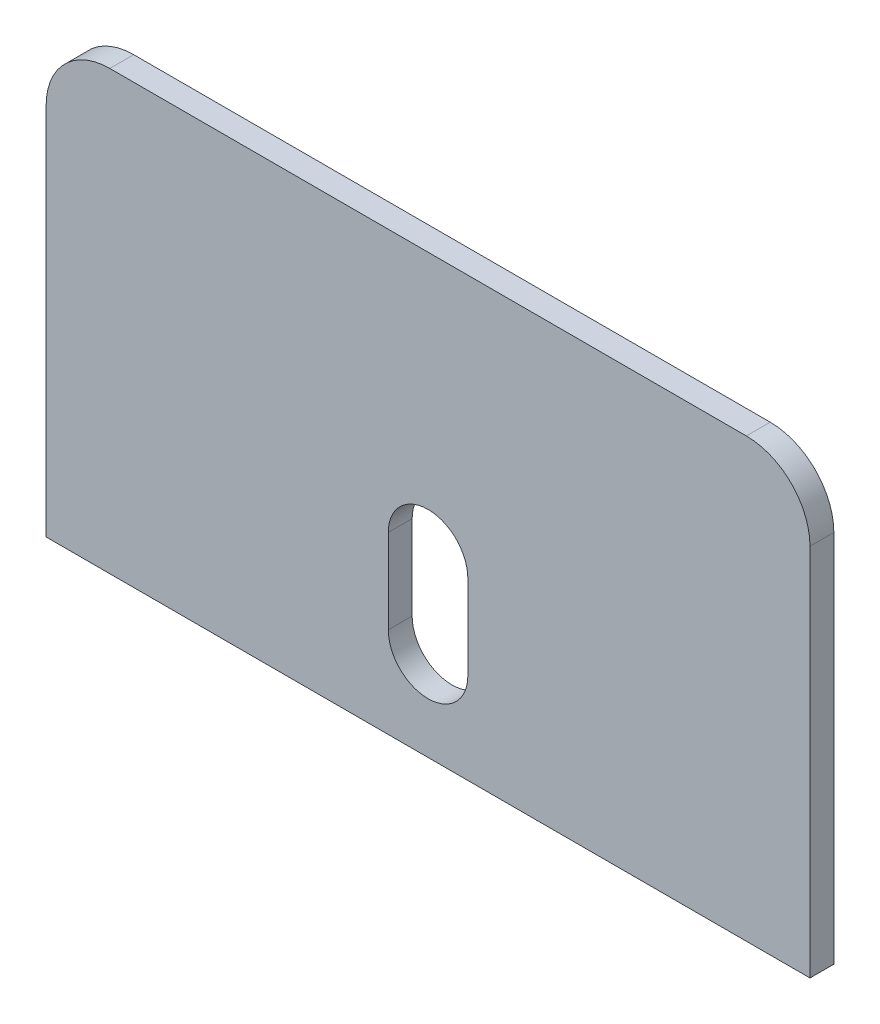
ISO-10303-21;
HEADER;
FILE_DESCRIPTION(('STEP AP214'),'2;1');
FILE_NAME('part.step','',(''),(''),'','','');
FILE_SCHEMA(('AUTOMOTIVE_DESIGN { 1 0 10303 214 1 1 1 1 }'));
ENDSEC;
DATA;
#1=APPLICATION_CONTEXT('core data for automotive mechanical design processes');
#2=APPLICATION_PROTOCOL_DEFINITION('international standard','automotive_design',2000,#1);
#3=PRODUCT_CONTEXT('',#1,'mechanical');
#4=PRODUCT('Part','Part','',(#3));
#5=PRODUCT_RELATED_PRODUCT_CATEGORY('part','',(#4));
#6=PRODUCT_DEFINITION_FORMATION('','',#4);
#7=PRODUCT_DEFINITION_CONTEXT('part definition',#1,'design');
#8=PRODUCT_DEFINITION('design','',#6,#7);
#9=PRODUCT_DEFINITION_SHAPE('','',#8);
#10=(LENGTH_UNIT() NAMED_UNIT(*) SI_UNIT(.MILLI.,.METRE.));
#11=(NAMED_UNIT(*) PLANE_ANGLE_UNIT() SI_UNIT($,.RADIAN.));
#12=(NAMED_UNIT(*) SI_UNIT($,.STERADIAN.) SOLID_ANGLE_UNIT());
#13=UNCERTAINTY_MEASURE_WITH_UNIT(LENGTH_MEASURE(1.E-05),#10,'distance_accuracy_value','');
#14=(GEOMETRIC_REPRESENTATION_CONTEXT(3) GLOBAL_UNCERTAINTY_ASSIGNED_CONTEXT((#13)) GLOBAL_UNIT_ASSIGNED_CONTEXT((#10,
#11,#12)) REPRESENTATION_CONTEXT('',''));
#15=CARTESIAN_POINT('',(0.,0.,0.));
#16=DIRECTION('',(0.,0.,1.));
#17=DIRECTION('',(1.,0.,0.));
#18=AXIS2_PLACEMENT_3D('',#15,#16,#17);
#19=CARTESIAN_POINT('',(0.,0.,1.5));
#20=DIRECTION('',(0.,0.,1.));
#21=DIRECTION('',(1.,0.,0.));
#22=AXIS2_PLACEMENT_3D('',#19,#20,#21);
#23=PLANE('',#22);
#24=DIRECTION('',(0.,1.,0.));
#25=VECTOR('',#24,1.);
#26=CARTESIAN_POINT('',(48.,-27.5,1.5));
#27=LINE('',#26,#25);
#28=CARTESIAN_POINT('',(48.,-27.5,1.5));
#29=VERTEX_POINT('',#28);
#30=CARTESIAN_POINT('',(48.,19.5,1.5));
#31=VERTEX_POINT('',#30);
#32=EDGE_CURVE('E208',#29,#31,#27,.T.);
#33=ORIENTED_EDGE('',*,*,#32,.T.);
#34=CARTESIAN_POINT('',(40.,19.5,1.5));
#35=DIRECTION('',(0.,0.,1.));
#36=DIRECTION('',(1.,0.,0.));
#37=AXIS2_PLACEMENT_3D('',#34,#35,#36);
#38=CIRCLE('',#37,8.);
#39=CARTESIAN_POINT('',(40.,27.5,1.5));
#40=VERTEX_POINT('',#39);
#41=EDGE_CURVE('E47',#31,#40,#38,.T.);
#42=ORIENTED_EDGE('',*,*,#41,.T.);
#43=DIRECTION('',(-1.,0.,0.));
#44=VECTOR('',#43,1.);
#45=CARTESIAN_POINT('',(48.,27.5,1.5));
#46=LINE('',#45,#44);
#47=CARTESIAN_POINT('',(-40.,27.5,1.5));
#48=VERTEX_POINT('',#47);
#49=EDGE_CURVE('E191',#40,#48,#46,.T.);
#50=ORIENTED_EDGE('',*,*,#49,.T.);
#51=CARTESIAN_POINT('',(-40.,19.5,1.5));
#52=DIRECTION('',(0.,0.,1.));
#53=DIRECTION('',(1.,0.,0.));
#54=AXIS2_PLACEMENT_3D('',#51,#52,#53);
#55=CIRCLE('',#54,8.);
#56=CARTESIAN_POINT('',(-48.,19.5,1.5));
#57=VERTEX_POINT('',#56);
#58=EDGE_CURVE('E54',#48,#57,#55,.T.);
#59=ORIENTED_EDGE('',*,*,#58,.T.);
#60=DIRECTION('',(0.,-1.,0.));
#61=VECTOR('',#60,1.);
#62=CARTESIAN_POINT('',(-48.,-27.5,1.5));
#63=LINE('',#62,#61);
#64=CARTESIAN_POINT('',(-48.,-27.5,1.5));
#65=VERTEX_POINT('',#64);
#66=EDGE_CURVE('E227',#57,#65,#63,.T.);
#67=ORIENTED_EDGE('',*,*,#66,.T.);
#68=DIRECTION('',(1.,0.,0.));
#69=VECTOR('',#68,1.);
#70=CARTESIAN_POINT('',(48.,-27.5,1.5));
#71=LINE('',#70,#69);
#72=EDGE_CURVE('E233',#65,#29,#71,.T.);
#73=ORIENTED_EDGE('',*,*,#72,.T.);
#74=EDGE_LOOP('',(#33,#42,#50,#59,#67,#73));
#75=FACE_BOUND('',#74,.T.);
#76=DIRECTION('',(0.,1.,0.));
#77=VECTOR('',#76,1.);
#78=CARTESIAN_POINT('',(5.,-16.1,1.5));
#79=LINE('',#78,#77);
#80=CARTESIAN_POINT('',(5.,-16.1,1.5));
#81=VERTEX_POINT('',#80);
#82=CARTESIAN_POINT('',(5.,-5.5,1.5));
#83=VERTEX_POINT('',#82);
#84=EDGE_CURVE('E130',#81,#83,#79,.T.);
#85=ORIENTED_EDGE('',*,*,#84,.F.);
#86=CARTESIAN_POINT('',(0.,-16.1,1.5));
#87=DIRECTION('',(0.,0.,1.));
#88=DIRECTION('',(1.,0.,0.));
#89=AXIS2_PLACEMENT_3D('',#86,#87,#88);
#90=CIRCLE('',#89,5.);
#91=CARTESIAN_POINT('',(-5.,-16.1,1.5));
#92=VERTEX_POINT('',#91);
#93=EDGE_CURVE('E120',#92,#81,#90,.T.);
#94=ORIENTED_EDGE('',*,*,#93,.F.);
#95=DIRECTION('',(0.,-1.,0.));
#96=VECTOR('',#95,1.);
#97=CARTESIAN_POINT('',(-5.,-16.1,1.5));
#98=LINE('',#97,#96);
#99=CARTESIAN_POINT('',(-5.,-5.5,1.5));
#100=VERTEX_POINT('',#99);
#101=EDGE_CURVE('E148',#100,#92,#98,.T.);
#102=ORIENTED_EDGE('',*,*,#101,.F.);
#103=CARTESIAN_POINT('',(0.,-5.50000000000001,1.5));
#104=DIRECTION('',(0.,0.,1.));
#105=DIRECTION('',(1.,0.,0.));
#106=AXIS2_PLACEMENT_3D('',#103,#104,#105);
#107=CIRCLE('',#106,5.);
#108=EDGE_CURVE('E143',#83,#100,#107,.T.);
#109=ORIENTED_EDGE('',*,*,#108,.F.);
#110=EDGE_LOOP('',(#85,#94,#102,#109));
#111=FACE_BOUND('',#110,.T.);
#112=ADVANCED_FACE('F39',(#75,#111),#23,.T.);
#113=CARTESIAN_POINT('',(0.,0.,-1.5));
#114=DIRECTION('',(0.,0.,1.));
#115=DIRECTION('',(1.,0.,0.));
#116=AXIS2_PLACEMENT_3D('',#113,#114,#115);
#117=PLANE('',#116);
#118=DIRECTION('',(-1.,0.,0.));
#119=VECTOR('',#118,1.);
#120=CARTESIAN_POINT('',(48.,27.5,-1.5));
#121=LINE('',#120,#119);
#122=CARTESIAN_POINT('',(40.,27.5,-1.5));
#123=VERTEX_POINT('',#122);
#124=CARTESIAN_POINT('',(-40.,27.5,-1.5));
#125=VERTEX_POINT('',#124);
#126=EDGE_CURVE('E192',#123,#125,#121,.T.);
#127=ORIENTED_EDGE('',*,*,#126,.F.);
#128=CARTESIAN_POINT('',(40.,19.5,-1.5));
#129=DIRECTION('',(0.,0.,1.));
#130=DIRECTION('',(1.,0.,0.));
#131=AXIS2_PLACEMENT_3D('',#128,#129,#130);
#132=CIRCLE('',#131,8.);
#133=CARTESIAN_POINT('',(48.,19.5,-1.5));
#134=VERTEX_POINT('',#133);
#135=EDGE_CURVE('E203',#123,#134,#132,.F.);
#136=ORIENTED_EDGE('',*,*,#135,.T.);
#137=DIRECTION('',(0.,1.,0.));
#138=VECTOR('',#137,1.);
#139=CARTESIAN_POINT('',(48.,-27.5,-1.5));
#140=LINE('',#139,#138);
#141=CARTESIAN_POINT('',(48.,-27.5,-1.5));
#142=VERTEX_POINT('',#141);
#143=EDGE_CURVE('E223',#142,#134,#140,.T.);
#144=ORIENTED_EDGE('',*,*,#143,.F.);
#145=DIRECTION('',(1.,0.,0.));
#146=VECTOR('',#145,1.);
#147=CARTESIAN_POINT('',(48.,-27.5,-1.5));
#148=LINE('',#147,#146);
#149=CARTESIAN_POINT('',(-48.,-27.5,-1.5));
#150=VERTEX_POINT('',#149);
#151=EDGE_CURVE('E226',#150,#142,#148,.T.);
#152=ORIENTED_EDGE('',*,*,#151,.F.);
#153=DIRECTION('',(0.,-1.,0.));
#154=VECTOR('',#153,1.);
#155=CARTESIAN_POINT('',(-48.,-27.5,-1.5));
#156=LINE('',#155,#154);
#157=CARTESIAN_POINT('',(-48.,19.5,-1.5));
#158=VERTEX_POINT('',#157);
#159=EDGE_CURVE('E138',#158,#150,#156,.T.);
#160=ORIENTED_EDGE('',*,*,#159,.F.);
#161=CARTESIAN_POINT('',(-40.,19.5,-1.5));
#162=DIRECTION('',(0.,0.,1.));
#163=DIRECTION('',(1.,0.,0.));
#164=AXIS2_PLACEMENT_3D('',#161,#162,#163);
#165=CIRCLE('',#164,8.);
#166=EDGE_CURVE('E201',#158,#125,#165,.F.);
#167=ORIENTED_EDGE('',*,*,#166,.T.);
#168=EDGE_LOOP('',(#127,#136,#144,#152,#160,#167));
#169=FACE_BOUND('',#168,.T.);
#170=CARTESIAN_POINT('',(0.,-16.1,-1.5));
#171=DIRECTION('',(0.,0.,1.));
#172=DIRECTION('',(1.,0.,0.));
#173=AXIS2_PLACEMENT_3D('',#170,#171,#172);
#174=CIRCLE('',#173,5.);
#175=CARTESIAN_POINT('',(-5.,-16.1,-1.5));
#176=VERTEX_POINT('',#175);
#177=CARTESIAN_POINT('',(5.,-16.1,-1.5));
#178=VERTEX_POINT('',#177);
#179=EDGE_CURVE('E161',#176,#178,#174,.T.);
#180=ORIENTED_EDGE('',*,*,#179,.T.);
#181=DIRECTION('',(0.,1.,0.));
#182=VECTOR('',#181,1.);
#183=CARTESIAN_POINT('',(5.,-16.1,-1.5));
#184=LINE('',#183,#182);
#185=CARTESIAN_POINT('',(5.,-5.5,-1.5));
#186=VERTEX_POINT('',#185);
#187=EDGE_CURVE('E137',#178,#186,#184,.T.);
#188=ORIENTED_EDGE('',*,*,#187,.T.);
#189=CARTESIAN_POINT('',(0.,-5.50000000000001,-1.5));
#190=DIRECTION('',(0.,0.,1.));
#191=DIRECTION('',(1.,0.,0.));
#192=AXIS2_PLACEMENT_3D('',#189,#190,#191);
#193=CIRCLE('',#192,5.);
#194=CARTESIAN_POINT('',(-5.,-5.5,-1.5));
#195=VERTEX_POINT('',#194);
#196=EDGE_CURVE('E360',#186,#195,#193,.T.);
#197=ORIENTED_EDGE('',*,*,#196,.T.);
#198=DIRECTION('',(0.,-1.,0.));
#199=VECTOR('',#198,1.);
#200=CARTESIAN_POINT('',(-5.,-16.1,-1.5));
#201=LINE('',#200,#199);
#202=EDGE_CURVE('E131',#195,#176,#201,.T.);
#203=ORIENTED_EDGE('',*,*,#202,.T.);
#204=EDGE_LOOP('',(#180,#188,#197,#203));
#205=FACE_BOUND('',#204,.T.);
#206=ADVANCED_FACE('F220',(#169,#205),#117,.F.);
#207=CARTESIAN_POINT('',(-48.,-27.5,1.5));
#208=DIRECTION('',(1.,0.,0.));
#209=DIRECTION('',(0.,0.,-1.));
#210=AXIS2_PLACEMENT_3D('',#207,#208,#209);
#211=PLANE('',#210);
#212=ORIENTED_EDGE('',*,*,#66,.F.);
#213=DIRECTION('',(0.,0.,-1.));
#214=VECTOR('',#213,1.);
#215=CARTESIAN_POINT('',(-48.,19.5,1.5));
#216=LINE('',#215,#214);
#217=EDGE_CURVE('E12',#57,#158,#216,.T.);
#218=ORIENTED_EDGE('',*,*,#217,.T.);
#219=ORIENTED_EDGE('',*,*,#159,.T.);
#220=DIRECTION('',(0.,0.,-1.));
#221=VECTOR('',#220,1.);
#222=CARTESIAN_POINT('',(-48.,-27.5,1.5));
#223=LINE('',#222,#221);
#224=EDGE_CURVE('E190',#65,#150,#223,.T.);
#225=ORIENTED_EDGE('',*,*,#224,.F.);
#226=EDGE_LOOP('',(#212,#218,#219,#225));
#227=FACE_BOUND('',#226,.T.);
#228=ADVANCED_FACE('F242',(#227),#211,.F.);
#229=CARTESIAN_POINT('',(48.,-27.5,1.5));
#230=DIRECTION('',(0.,1.,0.));
#231=DIRECTION('',(-1.,0.,0.));
#232=AXIS2_PLACEMENT_3D('',#229,#230,#231);
#233=PLANE('',#232);
#234=ORIENTED_EDGE('',*,*,#151,.T.);
#235=DIRECTION('',(0.,0.,-1.));
#236=VECTOR('',#235,1.);
#237=CARTESIAN_POINT('',(48.,-27.5,1.5));
#238=LINE('',#237,#236);
#239=EDGE_CURVE('E184',#29,#142,#238,.T.);
#240=ORIENTED_EDGE('',*,*,#239,.F.);
#241=ORIENTED_EDGE('',*,*,#72,.F.);
#242=ORIENTED_EDGE('',*,*,#224,.T.);
#243=EDGE_LOOP('',(#234,#240,#241,#242));
#244=FACE_BOUND('',#243,.T.);
#245=ADVANCED_FACE('F241',(#244),#233,.F.);
#246=CARTESIAN_POINT('',(48.,-27.5,1.5));
#247=DIRECTION('',(-1.,0.,0.));
#248=DIRECTION('',(0.,0.,1.));
#249=AXIS2_PLACEMENT_3D('',#246,#247,#248);
#250=PLANE('',#249);
#251=ORIENTED_EDGE('',*,*,#143,.T.);
#252=DIRECTION('',(0.,0.,-1.));
#253=VECTOR('',#252,1.);
#254=CARTESIAN_POINT('',(48.,19.5,1.5));
#255=LINE('',#254,#253);
#256=EDGE_CURVE('E62',#134,#31,#255,.F.);
#257=ORIENTED_EDGE('',*,*,#256,.T.);
#258=ORIENTED_EDGE('',*,*,#32,.F.);
#259=ORIENTED_EDGE('',*,*,#239,.T.);
#260=EDGE_LOOP('',(#251,#257,#258,#259));
#261=FACE_BOUND('',#260,.T.);
#262=ADVANCED_FACE('F224',(#261),#250,.F.);
#263=CARTESIAN_POINT('',(48.,27.5,1.5));
#264=DIRECTION('',(0.,-1.,0.));
#265=DIRECTION('',(1.,0.,0.));
#266=AXIS2_PLACEMENT_3D('',#263,#264,#265);
#267=PLANE('',#266);
#268=ORIENTED_EDGE('',*,*,#49,.F.);
#269=DIRECTION('',(0.,0.,-1.));
#270=VECTOR('',#269,1.);
#271=CARTESIAN_POINT('',(40.,27.5,1.5));
#272=LINE('',#271,#270);
#273=EDGE_CURVE('E198',#40,#123,#272,.T.);
#274=ORIENTED_EDGE('',*,*,#273,.T.);
#275=ORIENTED_EDGE('',*,*,#126,.T.);
#276=DIRECTION('',(0.,0.,-1.));
#277=VECTOR('',#276,1.);
#278=CARTESIAN_POINT('',(-40.,27.5,1.5));
#279=LINE('',#278,#277);
#280=EDGE_CURVE('E196',#125,#48,#279,.F.);
#281=ORIENTED_EDGE('',*,*,#280,.T.);
#282=EDGE_LOOP('',(#268,#274,#275,#281));
#283=FACE_BOUND('',#282,.T.);
#284=ADVANCED_FACE('F212',(#283),#267,.F.);
#285=CARTESIAN_POINT('',(0.,-16.1,1.5));
#286=DIRECTION('',(0.,0.,-1.));
#287=DIRECTION('',(-1.,0.,0.));
#288=AXIS2_PLACEMENT_3D('',#285,#286,#287);
#289=CYLINDRICAL_SURFACE('',#288,5.);
#290=ORIENTED_EDGE('',*,*,#179,.F.);
#291=DIRECTION('',(0.,0.,-1.));
#292=VECTOR('',#291,1.);
#293=CARTESIAN_POINT('',(-5.,-16.1,1.5));
#294=LINE('',#293,#292);
#295=EDGE_CURVE('E126',#92,#176,#294,.T.);
#296=ORIENTED_EDGE('',*,*,#295,.F.);
#297=ORIENTED_EDGE('',*,*,#93,.T.);
#298=DIRECTION('',(0.,0.,-1.));
#299=VECTOR('',#298,1.);
#300=CARTESIAN_POINT('',(5.,-16.1,1.5));
#301=LINE('',#300,#299);
#302=EDGE_CURVE('E123',#81,#178,#301,.T.);
#303=ORIENTED_EDGE('',*,*,#302,.T.);
#304=EDGE_LOOP('',(#290,#296,#297,#303));
#305=FACE_BOUND('',#304,.T.);
#306=ADVANCED_FACE('F122',(#305),#289,.F.);
#307=CARTESIAN_POINT('',(5.,-16.1,1.5));
#308=DIRECTION('',(-1.,0.,0.));
#309=DIRECTION('',(0.,0.,1.));
#310=AXIS2_PLACEMENT_3D('',#307,#308,#309);
#311=PLANE('',#310);
#312=ORIENTED_EDGE('',*,*,#187,.F.);
#313=ORIENTED_EDGE('',*,*,#302,.F.);
#314=ORIENTED_EDGE('',*,*,#84,.T.);
#315=DIRECTION('',(0.,0.,-1.));
#316=VECTOR('',#315,1.);
#317=CARTESIAN_POINT('',(5.,-5.5,1.5));
#318=LINE('',#317,#316);
#319=EDGE_CURVE('E139',#83,#186,#318,.T.);
#320=ORIENTED_EDGE('',*,*,#319,.T.);
#321=EDGE_LOOP('',(#312,#313,#314,#320));
#322=FACE_BOUND('',#321,.T.);
#323=ADVANCED_FACE('F134',(#322),#311,.T.);
#324=CARTESIAN_POINT('',(0.,-5.50000000000001,1.5));
#325=DIRECTION('',(0.,0.,-1.));
#326=DIRECTION('',(-1.,0.,0.));
#327=AXIS2_PLACEMENT_3D('',#324,#325,#326);
#328=CYLINDRICAL_SURFACE('',#327,5.);
#329=ORIENTED_EDGE('',*,*,#196,.F.);
#330=ORIENTED_EDGE('',*,*,#319,.F.);
#331=ORIENTED_EDGE('',*,*,#108,.T.);
#332=DIRECTION('',(0.,0.,-1.));
#333=VECTOR('',#332,1.);
#334=CARTESIAN_POINT('',(-5.,-5.5,1.5));
#335=LINE('',#334,#333);
#336=EDGE_CURVE('E177',#100,#195,#335,.T.);
#337=ORIENTED_EDGE('',*,*,#336,.T.);
#338=EDGE_LOOP('',(#329,#330,#331,#337));
#339=FACE_BOUND('',#338,.T.);
#340=ADVANCED_FACE('F296',(#339),#328,.F.);
#341=CARTESIAN_POINT('',(-5.,-16.1,1.5));
#342=DIRECTION('',(1.,0.,0.));
#343=DIRECTION('',(0.,0.,-1.));
#344=AXIS2_PLACEMENT_3D('',#341,#342,#343);
#345=PLANE('',#344);
#346=ORIENTED_EDGE('',*,*,#202,.F.);
#347=ORIENTED_EDGE('',*,*,#336,.F.);
#348=ORIENTED_EDGE('',*,*,#101,.T.);
#349=ORIENTED_EDGE('',*,*,#295,.T.);
#350=EDGE_LOOP('',(#346,#347,#348,#349));
#351=FACE_BOUND('',#350,.T.);
#352=ADVANCED_FACE('F249',(#351),#345,.T.);
#353=CARTESIAN_POINT('',(40.,19.5,1.5));
#354=DIRECTION('',(0.,0.,-1.));
#355=DIRECTION('',(-1.,0.,0.));
#356=AXIS2_PLACEMENT_3D('',#353,#354,#355);
#357=CYLINDRICAL_SURFACE('',#356,8.);
#358=ORIENTED_EDGE('',*,*,#41,.F.);
#359=ORIENTED_EDGE('',*,*,#256,.F.);
#360=ORIENTED_EDGE('',*,*,#135,.F.);
#361=ORIENTED_EDGE('',*,*,#273,.F.);
#362=EDGE_LOOP('',(#358,#359,#360,#361));
#363=FACE_BOUND('',#362,.T.);
#364=ADVANCED_FACE('F217',(#363),#357,.T.);
#365=CARTESIAN_POINT('',(-40.,19.5,1.5));
#366=DIRECTION('',(0.,0.,-1.));
#367=DIRECTION('',(-1.,0.,0.));
#368=AXIS2_PLACEMENT_3D('',#365,#366,#367);
#369=CYLINDRICAL_SURFACE('',#368,8.);
#370=ORIENTED_EDGE('',*,*,#58,.F.);
#371=ORIENTED_EDGE('',*,*,#280,.F.);
#372=ORIENTED_EDGE('',*,*,#166,.F.);
#373=ORIENTED_EDGE('',*,*,#217,.F.);
#374=EDGE_LOOP('',(#370,#371,#372,#373));
#375=FACE_BOUND('',#374,.T.);
#376=ADVANCED_FACE('F41',(#375),#369,.T.);
#377=CLOSED_SHELL('',(#112,#206,#228,#245,#262,#284,#306,#323,#340,#352,#364,#376));
#378=MANIFOLD_SOLID_BREP('B2',#377);
#379=ADVANCED_BREP_SHAPE_REPRESENTATION('',(#18,#378),#14);
#380=SHAPE_DEFINITION_REPRESENTATION(#9,#379);
ENDSEC;
END-ISO-10303-21;
